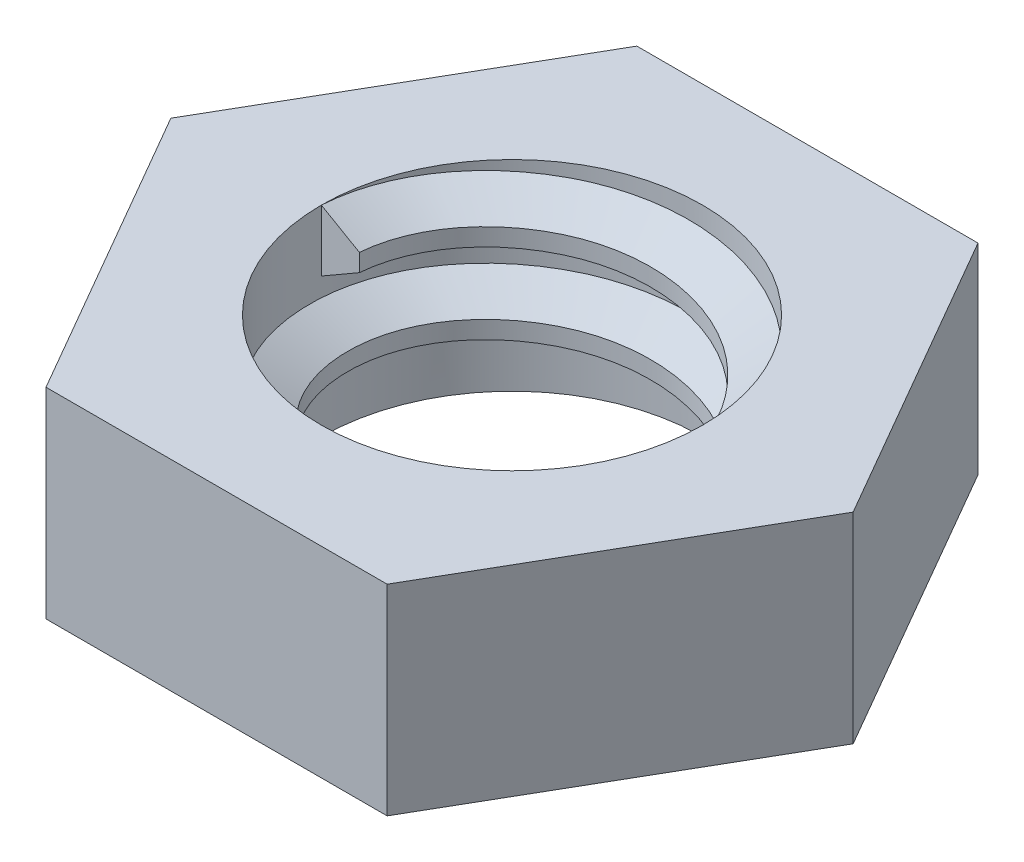
ISO-10303-21;
HEADER;
FILE_DESCRIPTION(('STEP AP214'),'2;1');
FILE_NAME('part.step','',(''),(''),'','','');
FILE_SCHEMA(('AUTOMOTIVE_DESIGN { 1 0 10303 214 1 1 1 1 }'));
ENDSEC;
DATA;
#1=APPLICATION_CONTEXT('core data for automotive mechanical design processes');
#2=APPLICATION_PROTOCOL_DEFINITION('international standard','automotive_design',2000,#1);
#3=PRODUCT_CONTEXT('',#1,'mechanical');
#4=PRODUCT('Part','Part','',(#3));
#5=PRODUCT_RELATED_PRODUCT_CATEGORY('part','',(#4));
#6=PRODUCT_DEFINITION_FORMATION('','',#4);
#7=PRODUCT_DEFINITION_CONTEXT('part definition',#1,'design');
#8=PRODUCT_DEFINITION('design','',#6,#7);
#9=PRODUCT_DEFINITION_SHAPE('','',#8);
#10=(LENGTH_UNIT() NAMED_UNIT(*) SI_UNIT(.MILLI.,.METRE.));
#11=(NAMED_UNIT(*) PLANE_ANGLE_UNIT() SI_UNIT($,.RADIAN.));
#12=(NAMED_UNIT(*) SI_UNIT($,.STERADIAN.) SOLID_ANGLE_UNIT());
#13=UNCERTAINTY_MEASURE_WITH_UNIT(LENGTH_MEASURE(1.E-05),#10,'distance_accuracy_value','');
#14=(GEOMETRIC_REPRESENTATION_CONTEXT(3) GLOBAL_UNCERTAINTY_ASSIGNED_CONTEXT((#13)) GLOBAL_UNIT_ASSIGNED_CONTEXT((#10,
#11,#12)) REPRESENTATION_CONTEXT('',''));
#15=CARTESIAN_POINT('',(0.,0.,0.));
#16=DIRECTION('',(0.,0.,1.));
#17=DIRECTION('',(1.,0.,0.));
#18=AXIS2_PLACEMENT_3D('',#15,#16,#17);
#19=CARTESIAN_POINT('',(0.,1.,0.));
#20=DIRECTION('',(0.,1.,0.));
#21=DIRECTION('',(0.,0.,1.));
#22=AXIS2_PLACEMENT_3D('',#19,#20,#21);
#23=PLANE('',#22);
#24=DIRECTION('',(0.5,0.,-0.866025403784439));
#25=VECTOR('',#24,1.);
#26=CARTESIAN_POINT('',(0.85,1.,1.47224318643355));
#27=LINE('',#26,#25);
#28=CARTESIAN_POINT('',(0.85,1.,1.47224318643355));
#29=VERTEX_POINT('',#28);
#30=CARTESIAN_POINT('',(1.7,1.,0.));
#31=VERTEX_POINT('',#30);
#32=EDGE_CURVE('E154',#29,#31,#27,.T.);
#33=ORIENTED_EDGE('',*,*,#32,.T.);
#34=DIRECTION('',(-0.5,0.,-0.866025403784439));
#35=VECTOR('',#34,1.);
#36=CARTESIAN_POINT('',(1.7,1.,0.));
#37=LINE('',#36,#35);
#38=CARTESIAN_POINT('',(0.849999999999999,1.,-1.47224318643355));
#39=VERTEX_POINT('',#38);
#40=EDGE_CURVE('E277',#31,#39,#37,.T.);
#41=ORIENTED_EDGE('',*,*,#40,.T.);
#42=DIRECTION('',(-1.,0.,0.));
#43=VECTOR('',#42,1.);
#44=CARTESIAN_POINT('',(0.849999999999999,1.,-1.47224318643355));
#45=LINE('',#44,#43);
#46=CARTESIAN_POINT('',(-0.85,1.,-1.47224318643355));
#47=VERTEX_POINT('',#46);
#48=EDGE_CURVE('E280',#39,#47,#45,.T.);
#49=ORIENTED_EDGE('',*,*,#48,.T.);
#50=DIRECTION('',(-0.5,0.,0.866025403784439));
#51=VECTOR('',#50,1.);
#52=CARTESIAN_POINT('',(-0.85,1.,-1.47224318643355));
#53=LINE('',#52,#51);
#54=CARTESIAN_POINT('',(-1.7,1.,0.));
#55=VERTEX_POINT('',#54);
#56=EDGE_CURVE('E283',#47,#55,#53,.T.);
#57=ORIENTED_EDGE('',*,*,#56,.T.);
#58=DIRECTION('',(0.5,0.,0.866025403784439));
#59=VECTOR('',#58,1.);
#60=CARTESIAN_POINT('',(-1.7,1.,0.));
#61=LINE('',#60,#59);
#62=CARTESIAN_POINT('',(-0.85,1.,1.47224318643355));
#63=VERTEX_POINT('',#62);
#64=EDGE_CURVE('E285',#55,#63,#61,.T.);
#65=ORIENTED_EDGE('',*,*,#64,.T.);
#66=DIRECTION('',(1.,0.,0.));
#67=VECTOR('',#66,1.);
#68=CARTESIAN_POINT('',(-0.85,1.,1.47224318643355));
#69=LINE('',#68,#67);
#70=EDGE_CURVE('E163',#63,#29,#69,.T.);
#71=ORIENTED_EDGE('',*,*,#70,.T.);
#72=EDGE_LOOP('',(#33,#41,#49,#57,#65,#71));
#73=FACE_BOUND('',#72,.T.);
#74=CARTESIAN_POINT('',(0.,1.,0.));
#75=DIRECTION('',(0.,1.,0.));
#76=DIRECTION('',(0.,0.,1.));
#77=AXIS2_PLACEMENT_3D('',#74,#75,#76);
#78=CIRCLE('',#77,0.95);
#79=CARTESIAN_POINT('',(-0.95,1.,0.));
#80=VERTEX_POINT('',#79);
#81=EDGE_CURVE('E88',#80,#80,#78,.T.);
#82=ORIENTED_EDGE('',*,*,#81,.F.);
#83=EDGE_LOOP('',(#82));
#84=FACE_BOUND('',#83,.T.);
#85=ADVANCED_FACE('F51',(#73,#84),#23,.T.);
#86=CARTESIAN_POINT('',(0.,0.,0.));
#87=DIRECTION('',(0.,1.,0.));
#88=DIRECTION('',(0.,0.,1.));
#89=AXIS2_PLACEMENT_3D('',#86,#87,#88);
#90=PLANE('',#89);
#91=DIRECTION('',(0.5,0.,-0.866025403784439));
#92=VECTOR('',#91,1.);
#93=CARTESIAN_POINT('',(0.85,0.,1.47224318643355));
#94=LINE('',#93,#92);
#95=CARTESIAN_POINT('',(0.85,0.,1.47224318643355));
#96=VERTEX_POINT('',#95);
#97=CARTESIAN_POINT('',(1.7,0.,0.));
#98=VERTEX_POINT('',#97);
#99=EDGE_CURVE('E160',#96,#98,#94,.T.);
#100=ORIENTED_EDGE('',*,*,#99,.F.);
#101=DIRECTION('',(1.,0.,0.));
#102=VECTOR('',#101,1.);
#103=CARTESIAN_POINT('',(-0.85,0.,1.47224318643355));
#104=LINE('',#103,#102);
#105=CARTESIAN_POINT('',(-0.85,0.,1.47224318643355));
#106=VERTEX_POINT('',#105);
#107=EDGE_CURVE('E142',#106,#96,#104,.T.);
#108=ORIENTED_EDGE('',*,*,#107,.F.);
#109=DIRECTION('',(0.5,0.,0.866025403784439));
#110=VECTOR('',#109,1.);
#111=CARTESIAN_POINT('',(-1.7,0.,0.));
#112=LINE('',#111,#110);
#113=CARTESIAN_POINT('',(-1.7,0.,0.));
#114=VERTEX_POINT('',#113);
#115=EDGE_CURVE('E155',#114,#106,#112,.T.);
#116=ORIENTED_EDGE('',*,*,#115,.F.);
#117=DIRECTION('',(-0.5,0.,0.866025403784439));
#118=VECTOR('',#117,1.);
#119=CARTESIAN_POINT('',(-0.85,0.,-1.47224318643355));
#120=LINE('',#119,#118);
#121=CARTESIAN_POINT('',(-0.85,0.,-1.47224318643355));
#122=VERTEX_POINT('',#121);
#123=EDGE_CURVE('E182',#122,#114,#120,.T.);
#124=ORIENTED_EDGE('',*,*,#123,.F.);
#125=DIRECTION('',(-1.,0.,0.));
#126=VECTOR('',#125,1.);
#127=CARTESIAN_POINT('',(0.849999999999999,0.,-1.47224318643355));
#128=LINE('',#127,#126);
#129=CARTESIAN_POINT('',(0.849999999999999,0.,-1.47224318643355));
#130=VERTEX_POINT('',#129);
#131=EDGE_CURVE('E173',#130,#122,#128,.T.);
#132=ORIENTED_EDGE('',*,*,#131,.F.);
#133=DIRECTION('',(-0.5,0.,-0.866025403784439));
#134=VECTOR('',#133,1.);
#135=CARTESIAN_POINT('',(1.7,0.,0.));
#136=LINE('',#135,#134);
#137=EDGE_CURVE('E168',#98,#130,#136,.T.);
#138=ORIENTED_EDGE('',*,*,#137,.F.);
#139=EDGE_LOOP('',(#100,#108,#116,#124,#132,#138));
#140=FACE_BOUND('',#139,.T.);
#141=CARTESIAN_POINT('',(0.,0.,0.));
#142=DIRECTION('',(0.,1.,0.));
#143=DIRECTION('',(0.,0.,1.));
#144=AXIS2_PLACEMENT_3D('',#141,#142,#143);
#145=CIRCLE('',#144,0.95);
#146=CARTESIAN_POINT('',(0.148604981954542,0.00198897041404559,0.938305152491235));
#147=VERTEX_POINT('',#146);
#148=EDGE_CURVE('E175',#147,#147,#145,.T.);
#149=ORIENTED_EDGE('',*,*,#148,.T.);
#150=EDGE_LOOP('',(#149));
#151=FACE_BOUND('',#150,.T.);
#152=ADVANCED_FACE('F165',(#140,#151),#90,.F.);
#153=CARTESIAN_POINT('',(0.85,1.,1.47224318643355));
#154=DIRECTION('',(-0.866025403784439,0.,-0.5));
#155=DIRECTION('',(-0.5,0.,0.866025403784439));
#156=AXIS2_PLACEMENT_3D('',#153,#154,#155);
#157=PLANE('',#156);
#158=ORIENTED_EDGE('',*,*,#99,.T.);
#159=DIRECTION('',(0.,-1.,0.));
#160=VECTOR('',#159,1.);
#161=CARTESIAN_POINT('',(1.7,1.,0.));
#162=LINE('',#161,#160);
#163=EDGE_CURVE('E12',#31,#98,#162,.T.);
#164=ORIENTED_EDGE('',*,*,#163,.F.);
#165=ORIENTED_EDGE('',*,*,#32,.F.);
#166=DIRECTION('',(0.,-1.,0.));
#167=VECTOR('',#166,1.);
#168=CARTESIAN_POINT('',(0.85,1.,1.47224318643355));
#169=LINE('',#168,#167);
#170=EDGE_CURVE('E146',#29,#96,#169,.T.);
#171=ORIENTED_EDGE('',*,*,#170,.T.);
#172=EDGE_LOOP('',(#158,#164,#165,#171));
#173=FACE_BOUND('',#172,.T.);
#174=ADVANCED_FACE('F53',(#173),#157,.F.);
#175=CARTESIAN_POINT('',(1.7,1.,0.));
#176=DIRECTION('',(-0.866025403784439,0.,0.5));
#177=DIRECTION('',(0.5,0.,0.866025403784439));
#178=AXIS2_PLACEMENT_3D('',#175,#176,#177);
#179=PLANE('',#178);
#180=ORIENTED_EDGE('',*,*,#137,.T.);
#181=DIRECTION('',(0.,-1.,0.));
#182=VECTOR('',#181,1.);
#183=CARTESIAN_POINT('',(0.849999999999999,1.,-1.47224318643355));
#184=LINE('',#183,#182);
#185=EDGE_CURVE('E63',#39,#130,#184,.T.);
#186=ORIENTED_EDGE('',*,*,#185,.F.);
#187=ORIENTED_EDGE('',*,*,#40,.F.);
#188=ORIENTED_EDGE('',*,*,#163,.T.);
#189=EDGE_LOOP('',(#180,#186,#187,#188));
#190=FACE_BOUND('',#189,.T.);
#191=ADVANCED_FACE('F292',(#190),#179,.F.);
#192=CARTESIAN_POINT('',(0.849999999999999,1.,-1.47224318643355));
#193=DIRECTION('',(0.,0.,1.));
#194=DIRECTION('',(1.,0.,0.));
#195=AXIS2_PLACEMENT_3D('',#192,#193,#194);
#196=PLANE('',#195);
#197=ORIENTED_EDGE('',*,*,#131,.T.);
#198=DIRECTION('',(0.,-1.,0.));
#199=VECTOR('',#198,1.);
#200=CARTESIAN_POINT('',(-0.85,1.,-1.47224318643355));
#201=LINE('',#200,#199);
#202=EDGE_CURVE('E193',#47,#122,#201,.T.);
#203=ORIENTED_EDGE('',*,*,#202,.F.);
#204=ORIENTED_EDGE('',*,*,#48,.F.);
#205=ORIENTED_EDGE('',*,*,#185,.T.);
#206=EDGE_LOOP('',(#197,#203,#204,#205));
#207=FACE_BOUND('',#206,.T.);
#208=ADVANCED_FACE('F296',(#207),#196,.F.);
#209=CARTESIAN_POINT('',(-0.85,1.,-1.47224318643355));
#210=DIRECTION('',(0.866025403784439,0.,0.5));
#211=DIRECTION('',(0.5,0.,-0.866025403784439));
#212=AXIS2_PLACEMENT_3D('',#209,#210,#211);
#213=PLANE('',#212);
#214=ORIENTED_EDGE('',*,*,#123,.T.);
#215=DIRECTION('',(0.,-1.,0.));
#216=VECTOR('',#215,1.);
#217=CARTESIAN_POINT('',(-1.7,1.,0.));
#218=LINE('',#217,#216);
#219=EDGE_CURVE('E189',#55,#114,#218,.T.);
#220=ORIENTED_EDGE('',*,*,#219,.F.);
#221=ORIENTED_EDGE('',*,*,#56,.F.);
#222=ORIENTED_EDGE('',*,*,#202,.T.);
#223=EDGE_LOOP('',(#214,#220,#221,#222));
#224=FACE_BOUND('',#223,.T.);
#225=ADVANCED_FACE('F300',(#224),#213,.F.);
#226=CARTESIAN_POINT('',(-1.7,1.,0.));
#227=DIRECTION('',(0.866025403784439,0.,-0.5));
#228=DIRECTION('',(-0.5,0.,-0.866025403784439));
#229=AXIS2_PLACEMENT_3D('',#226,#227,#228);
#230=PLANE('',#229);
#231=ORIENTED_EDGE('',*,*,#115,.T.);
#232=DIRECTION('',(0.,-1.,0.));
#233=VECTOR('',#232,1.);
#234=CARTESIAN_POINT('',(-0.85,1.,1.47224318643355));
#235=LINE('',#234,#233);
#236=EDGE_CURVE('E149',#63,#106,#235,.T.);
#237=ORIENTED_EDGE('',*,*,#236,.F.);
#238=ORIENTED_EDGE('',*,*,#64,.F.);
#239=ORIENTED_EDGE('',*,*,#219,.T.);
#240=EDGE_LOOP('',(#231,#237,#238,#239));
#241=FACE_BOUND('',#240,.T.);
#242=ADVANCED_FACE('F303',(#241),#230,.F.);
#243=CARTESIAN_POINT('',(-0.85,1.,1.47224318643355));
#244=DIRECTION('',(0.,0.,-1.));
#245=DIRECTION('',(-1.,0.,0.));
#246=AXIS2_PLACEMENT_3D('',#243,#244,#245);
#247=PLANE('',#246);
#248=ORIENTED_EDGE('',*,*,#107,.T.);
#249=ORIENTED_EDGE('',*,*,#170,.F.);
#250=ORIENTED_EDGE('',*,*,#70,.F.);
#251=ORIENTED_EDGE('',*,*,#236,.T.);
#252=EDGE_LOOP('',(#248,#249,#250,#251));
#253=FACE_BOUND('',#252,.T.);
#254=ADVANCED_FACE('F144',(#253),#247,.F.);
#255=CARTESIAN_POINT('',(0.,1.,0.));
#256=DIRECTION('',(0.,-1.,0.));
#257=DIRECTION('',(0.,0.,-1.));
#258=AXIS2_PLACEMENT_3D('',#255,#256,#257);
#259=CYLINDRICAL_SURFACE('',#258,0.95);
#260=DIRECTION('',(0.,1.,0.));
#261=VECTOR('',#260,1.);
#262=CARTESIAN_POINT('',(-0.95,0.945312500238979,0.));
#263=LINE('',#262,#261);
#264=CARTESIAN_POINT('',(-0.95,0.693750000955916,0.));
#265=VERTEX_POINT('',#264);
#266=EDGE_CURVE('E206',#80,#265,#263,.F.);
#267=ORIENTED_EDGE('',*,*,#266,.F.);
#268=ORIENTED_EDGE('',*,*,#81,.T.);
#269=CARTESIAN_POINT('',(-0.95,1.,0.));
#270=CARTESIAN_POINT('',(-0.95,0.966666666666667,-0.548482755730144));
#271=CARTESIAN_POINT('',(-0.475,0.933333333333333,-0.822724133595217));
#272=CARTESIAN_POINT('',(0.,0.9,-1.09696551146029));
#273=CARTESIAN_POINT('',(0.475,0.866666666666667,-0.822724133595217));
#274=CARTESIAN_POINT('',(0.95,0.833333333333333,-0.548482755730145));
#275=CARTESIAN_POINT('',(0.95,0.8,0.));
#276=CARTESIAN_POINT('',(0.95,0.766666666666667,0.548482755730144));
#277=CARTESIAN_POINT('',(0.475,0.733333333333333,0.822724133595216));
#278=CARTESIAN_POINT('',(0.,0.7,1.09696551146029));
#279=CARTESIAN_POINT('',(-0.474999999999999,0.666666666666667,0.822724133595217));
#280=CARTESIAN_POINT('',(-0.95,0.633333333333333,0.548482755730145));
#281=CARTESIAN_POINT('',(-0.95,0.6,0.));
#282=CARTESIAN_POINT('',(-0.95,0.566666666666667,-0.548482755730144));
#283=CARTESIAN_POINT('',(-0.475,0.533333333333333,-0.822724133595217));
#284=CARTESIAN_POINT('',(0.,0.5,-1.09696551146029));
#285=CARTESIAN_POINT('',(0.475,0.466666666666667,-0.822724133595217));
#286=CARTESIAN_POINT('',(0.95,0.433333333333333,-0.548482755730145));
#287=CARTESIAN_POINT('',(0.95,0.4,0.));
#288=CARTESIAN_POINT('',(0.95,0.366666666666667,0.548482755730144));
#289=CARTESIAN_POINT('',(0.475,0.333333333333333,0.822724133595216));
#290=CARTESIAN_POINT('',(0.322496472395081,0.322631331396146,0.910772086310284));
#291=CARTESIAN_POINT('',(0.148567264836274,0.310425772970967,0.938311125277255));
#292=(BOUNDED_CURVE() B_SPLINE_CURVE(2,(#269,#270,#271,#272,#273,#274,#275,#276,#277,#278,#279,
#280,#281,#282,#283,#284,#285,#286,#287,#288,#289,#290,#291),.UNSPECIFIED.,.F.,
.F.) B_SPLINE_CURVE_WITH_KNOTS((3,2,2,2,2,2,2,2,2,2,2,3),(0.,0.0833333333333333,
0.166666666666667,0.25,0.333333333333333,0.416666666666667,0.5,0.583333333333333,
0.666666666666667,0.75,0.833333333333333,0.862765509673159),
.UNSPECIFIED.) CURVE() GEOMETRIC_REPRESENTATION_ITEM() RATIONAL_B_SPLINE_CURVE((1.,
0.866025403784439,1.,0.866025403784439,1.,0.866025403784439,1.,0.866025403784439,1.,
0.866025403784439,1.,0.866025403784439,1.,0.866025403784439,1.,0.866025403784439,1.,
0.866025403784439,1.,0.866025403784439,1.,0.95268203270952,0.938788163595093)) REPRESENTATION_ITEM(''));
#293=CARTESIAN_POINT('',(0.148567264836274,0.310425772970967,0.938311125277255));
#294=VERTEX_POINT('',#293);
#295=EDGE_CURVE('E79',#80,#294,#292,.T.);
#296=ORIENTED_EDGE('',*,*,#295,.T.);
#297=DIRECTION('',(-0.000197994769630762,0.999999979906905,3.13729444486257E-05));
#298=VECTOR('',#297,1.);
#299=CARTESIAN_POINT('',(0.148572679415215,0.283082023090456,0.938310271584599));
#300=LINE('',#299,#298);
#301=EDGE_CURVE('E209',#147,#294,#300,.T.);
#302=ORIENTED_EDGE('',*,*,#301,.F.);
#303=ORIENTED_EDGE('',*,*,#148,.F.);
#304=CARTESIAN_POINT('',(-0.95,0.693750000955916,0.));
#305=CARTESIAN_POINT('',(-0.95,0.660416667622582,-0.548482755730144));
#306=CARTESIAN_POINT('',(-0.475,0.627083334289249,-0.822724133595217));
#307=CARTESIAN_POINT('',(0.,0.593750000955915,-1.09696551146029));
#308=CARTESIAN_POINT('',(0.475,0.560416667622582,-0.822724133595217));
#309=CARTESIAN_POINT('',(0.95,0.527083334289249,-0.548482755730145));
#310=CARTESIAN_POINT('',(0.95,0.493750000955916,0.));
#311=CARTESIAN_POINT('',(0.95,0.460416667622582,0.548482755730144));
#312=CARTESIAN_POINT('',(0.475,0.427083334289249,0.822724133595216));
#313=CARTESIAN_POINT('',(0.,0.393750000955915,1.09696551146029));
#314=CARTESIAN_POINT('',(-0.474999999999999,0.360416667622582,0.822724133595217));
#315=CARTESIAN_POINT('',(-0.95,0.327083334289249,0.548482755730145));
#316=CARTESIAN_POINT('',(-0.95,0.293750000955915,0.));
#317=CARTESIAN_POINT('',(-0.95,0.260416667622582,-0.548482755730144));
#318=CARTESIAN_POINT('',(-0.475,0.227083334289249,-0.822724133595217));
#319=CARTESIAN_POINT('',(0.,0.193750000955915,-1.09696551146029));
#320=CARTESIAN_POINT('',(0.475,0.160416667622582,-0.822724133595217));
#321=CARTESIAN_POINT('',(0.95,0.127083334289249,-0.548482755730145));
#322=CARTESIAN_POINT('',(0.95,0.0937500009559154,0.));
#323=CARTESIAN_POINT('',(0.95,0.0604166676225821,0.548482755730144));
#324=CARTESIAN_POINT('',(0.475,0.0270833342892487,0.822724133595216));
#325=CARTESIAN_POINT('',(0.322503841786664,0.016381849502348,0.91076783159007));
#326=CARTESIAN_POINT('',(0.148583515934073,0.00417691435479775,0.93830855201936));
#327=(BOUNDED_CURVE() B_SPLINE_CURVE(2,(#304,#305,#306,#307,#308,#309,#310,#311,#312,#313,#314,
#315,#316,#317,#318,#319,#320,#321,#322,#323,#324,#325,#326),.UNSPECIFIED.,.F.,
.F.) B_SPLINE_CURVE_WITH_KNOTS((3,2,2,2,2,2,2,2,2,2,2,3),(0.,0.0833333333333333,
0.166666666666667,0.25,0.333333333333333,0.416666666666667,0.5,0.583333333333333,
0.666666666666667,0.75,0.833333333333333,0.862764154723721),
.UNSPECIFIED.) CURVE() GEOMETRIC_REPRESENTATION_ITEM() RATIONAL_B_SPLINE_CURVE((1.,
0.866025403784439,1.,0.866025403784439,1.,0.866025403784439,1.,0.866025403784439,1.,
0.866025403784439,1.,0.866025403784439,1.,0.866025403784439,1.,0.866025403784439,1.,
0.866025403784439,1.,0.866025403784439,1.,0.952684211055165,0.938789442911468)) REPRESENTATION_ITEM(''));
#328=EDGE_CURVE('E71',#265,#147,#327,.T.);
#329=ORIENTED_EDGE('',*,*,#328,.F.);
#330=EDGE_LOOP('',(#267,#268,#296,#302,#303,#329));
#331=FACE_BOUND('',#330,.T.);
#332=ADVANCED_FACE('F263',(#331),#259,.F.);
#333=CARTESIAN_POINT('',(-0.855278471875,0.945312500238979,0.));
#334=DIRECTION('',(0.,0.,1.));
#335=DIRECTION('',(1.,0.,0.));
#336=AXIS2_PLACEMENT_3D('',#333,#334,#335);
#337=PLANE('',#336);
#338=CARTESIAN_POINT('',(-0.76055694375,0.890625000477958,0.));
#339=CARTESIAN_POINT('',(-0.95,1.,0.));
#340=(BOUNDED_CURVE() B_SPLINE_CURVE(1,(#338,#339),.UNSPECIFIED.,.F.,
.F.) B_SPLINE_CURVE_WITH_KNOTS((2,2),(0.,1.),
.UNSPECIFIED.) CURVE() GEOMETRIC_REPRESENTATION_ITEM() RATIONAL_B_SPLINE_CURVE((1.,1.)) REPRESENTATION_ITEM(''));
#341=CARTESIAN_POINT('',(-0.76055694375,0.890625000477958,0.));
#342=VERTEX_POINT('',#341);
#343=EDGE_CURVE('E527',#342,#80,#340,.T.);
#344=ORIENTED_EDGE('',*,*,#343,.T.);
#345=ORIENTED_EDGE('',*,*,#266,.T.);
#346=CARTESIAN_POINT('',(-0.95,0.693750000955916,0.));
#347=CARTESIAN_POINT('',(-0.76055694375,0.803125000477958,0.));
#348=(BOUNDED_CURVE() B_SPLINE_CURVE(1,(#346,#347),.UNSPECIFIED.,.F.,
.F.) B_SPLINE_CURVE_WITH_KNOTS((2,2),(0.,1.),
.UNSPECIFIED.) CURVE() GEOMETRIC_REPRESENTATION_ITEM() RATIONAL_B_SPLINE_CURVE((1.,1.)) REPRESENTATION_ITEM(''));
#349=CARTESIAN_POINT('',(-0.76055694375,0.803125000477958,0.));
#350=VERTEX_POINT('',#349);
#351=EDGE_CURVE('E95',#265,#350,#348,.T.);
#352=ORIENTED_EDGE('',*,*,#351,.T.);
#353=CARTESIAN_POINT('',(-0.76055694375,0.803125000477958,0.));
#354=CARTESIAN_POINT('',(-0.76055694375,0.890625000477958,0.));
#355=(BOUNDED_CURVE() B_SPLINE_CURVE(1,(#353,#354),.UNSPECIFIED.,.F.,
.F.) B_SPLINE_CURVE_WITH_KNOTS((2,2),(0.,1.),
.UNSPECIFIED.) CURVE() GEOMETRIC_REPRESENTATION_ITEM() RATIONAL_B_SPLINE_CURVE((1.,1.)) REPRESENTATION_ITEM(''));
#356=EDGE_CURVE('E240',#350,#342,#355,.T.);
#357=ORIENTED_EDGE('',*,*,#356,.T.);
#358=EDGE_LOOP('',(#344,#345,#352,#357));
#359=FACE_BOUND('',#358,.T.);
#360=ADVANCED_FACE('F261',(#359),#337,.T.);
#361=CARTESIAN_POINT('',(0.141160676228567,0.283082023090456,0.891533091780965));
#362=DIRECTION('',(0.987677794935856,0.000200464935698279,-0.156500904803949));
#363=DIRECTION('',(-0.156500907948536,0.,-0.987677814781361));
#364=AXIS2_PLACEMENT_3D('',#361,#362,#363);
#365=PLANE('',#364);
#366=CARTESIAN_POINT('',(0.118940910405446,0.201050773448924,0.751198991292097));
#367=CARTESIAN_POINT('',(0.148567264836274,0.310425772970967,0.938311125277255));
#368=(BOUNDED_CURVE() B_SPLINE_CURVE(1,(#366,#367),.UNSPECIFIED.,.F.,
.F.) B_SPLINE_CURVE_WITH_KNOTS((2,2),(0.,1.),
.UNSPECIFIED.) CURVE() GEOMETRIC_REPRESENTATION_ITEM() RATIONAL_B_SPLINE_CURVE((0.938788163595093,0.938788163595093)) REPRESENTATION_ITEM(''));
#369=CARTESIAN_POINT('',(0.118940910405446,0.201050773448924,0.751198991292097));
#370=VERTEX_POINT('',#369);
#371=EDGE_CURVE('E203',#294,#370,#368,.F.);
#372=ORIENTED_EDGE('',*,*,#371,.T.);
#373=CARTESIAN_POINT('',(0.118940910405446,0.113550773448924,0.751198991292097));
#374=CARTESIAN_POINT('',(0.118940910405446,0.201050773448924,0.751198991292097));
#375=(BOUNDED_CURVE() B_SPLINE_CURVE(1,(#373,#374),.UNSPECIFIED.,.F.,
.F.) B_SPLINE_CURVE_WITH_KNOTS((2,2),(0.,1.),
.UNSPECIFIED.) CURVE() GEOMETRIC_REPRESENTATION_ITEM() RATIONAL_B_SPLINE_CURVE((0.938788163595093,0.938788163595093)) REPRESENTATION_ITEM(''));
#376=CARTESIAN_POINT('',(0.118947415608222,0.113551343662882,0.751197961234645));
#377=VERTEX_POINT('',#376);
#378=EDGE_CURVE('E237',#370,#377,#375,.F.);
#379=ORIENTED_EDGE('',*,*,#378,.T.);
#380=CARTESIAN_POINT('',(0.148583515934073,0.00417691435479775,0.93830855201936));
#381=CARTESIAN_POINT('',(0.118953920810998,0.11355191387684,0.751196931177192));
#382=(BOUNDED_CURVE() B_SPLINE_CURVE(1,(#380,#381),.UNSPECIFIED.,.F.,
.F.) B_SPLINE_CURVE_WITH_KNOTS((2,2),(0.,1.),
.UNSPECIFIED.) CURVE() GEOMETRIC_REPRESENTATION_ITEM() RATIONAL_B_SPLINE_CURVE((0.938789442911468,0.938789442911468)) REPRESENTATION_ITEM(''));
#383=EDGE_CURVE('E228',#377,#147,#382,.F.);
#384=ORIENTED_EDGE('',*,*,#383,.T.);
#385=ORIENTED_EDGE('',*,*,#301,.T.);
#386=EDGE_LOOP('',(#372,#379,#384,#385));
#387=FACE_BOUND('',#386,.T.);
#388=ADVANCED_FACE('F234',(#387),#365,.F.);
#389=CARTESIAN_POINT('',(-0.76055694375,0.890625000477958,0.));
#390=CARTESIAN_POINT('',(-0.76055694375,0.857291667144624,-0.439107756208101));
#391=CARTESIAN_POINT('',(-0.380278471875,0.823958333811291,-0.658661634312152));
#392=CARTESIAN_POINT('',(0.,0.790625000477958,-0.878215512416203));
#393=CARTESIAN_POINT('',(0.380278471875,0.757291667144624,-0.658661634312152));
#394=CARTESIAN_POINT('',(0.76055694375,0.723958333811291,-0.439107756208102));
#395=CARTESIAN_POINT('',(0.76055694375,0.690625000477958,0.));
#396=CARTESIAN_POINT('',(0.76055694375,0.657291667144624,0.439107756208101));
#397=CARTESIAN_POINT('',(0.380278471875,0.623958333811291,0.658661634312152));
#398=CARTESIAN_POINT('',(0.,0.590625000477958,0.878215512416203));
#399=CARTESIAN_POINT('',(-0.380278471874999,0.557291667144624,0.658661634312153));
#400=CARTESIAN_POINT('',(-0.76055694375,0.523958333811291,0.439107756208102));
#401=CARTESIAN_POINT('',(-0.76055694375,0.490625000477958,0.));
#402=CARTESIAN_POINT('',(-0.76055694375,0.457291667144624,-0.439107756208101));
#403=CARTESIAN_POINT('',(-0.380278471875,0.423958333811291,-0.658661634312152));
#404=CARTESIAN_POINT('',(0.,0.390625000477958,-0.878215512416203));
#405=CARTESIAN_POINT('',(0.380278471875,0.357291667144624,-0.658661634312152));
#406=CARTESIAN_POINT('',(0.76055694375,0.323958333811291,-0.439107756208102));
#407=CARTESIAN_POINT('',(0.76055694375,0.290625000477958,0.));
#408=CARTESIAN_POINT('',(0.76055694375,0.257291667144624,0.439107756208101));
#409=CARTESIAN_POINT('',(0.380278471875,0.223958333811291,0.658661634312152));
#410=CARTESIAN_POINT('',(0.258186243594694,0.213256331874104,0.729151615175748));
#411=CARTESIAN_POINT('',(0.118940910405446,0.201050773448924,0.751198991292097));
#412=CARTESIAN_POINT('',(-0.95,1.,0.));
#413=CARTESIAN_POINT('',(-0.95,0.966666666666667,-0.548482755730144));
#414=CARTESIAN_POINT('',(-0.475,0.933333333333333,-0.822724133595217));
#415=CARTESIAN_POINT('',(0.,0.9,-1.09696551146029));
#416=CARTESIAN_POINT('',(0.475,0.866666666666667,-0.822724133595217));
#417=CARTESIAN_POINT('',(0.95,0.833333333333333,-0.548482755730145));
#418=CARTESIAN_POINT('',(0.95,0.8,0.));
#419=CARTESIAN_POINT('',(0.95,0.766666666666667,0.548482755730144));
#420=CARTESIAN_POINT('',(0.475,0.733333333333333,0.822724133595216));
#421=CARTESIAN_POINT('',(0.,0.7,1.09696551146029));
#422=CARTESIAN_POINT('',(-0.474999999999999,0.666666666666667,0.822724133595217));
#423=CARTESIAN_POINT('',(-0.95,0.633333333333333,0.548482755730145));
#424=CARTESIAN_POINT('',(-0.95,0.6,0.));
#425=CARTESIAN_POINT('',(-0.95,0.566666666666667,-0.548482755730144));
#426=CARTESIAN_POINT('',(-0.475,0.533333333333333,-0.822724133595217));
#427=CARTESIAN_POINT('',(0.,0.5,-1.09696551146029));
#428=CARTESIAN_POINT('',(0.475,0.466666666666667,-0.822724133595217));
#429=CARTESIAN_POINT('',(0.95,0.433333333333333,-0.548482755730145));
#430=CARTESIAN_POINT('',(0.95,0.4,0.));
#431=CARTESIAN_POINT('',(0.95,0.366666666666667,0.548482755730144));
#432=CARTESIAN_POINT('',(0.475,0.333333333333333,0.822724133595216));
#433=CARTESIAN_POINT('',(0.322496472395081,0.322631331396146,0.910772086310284));
#434=CARTESIAN_POINT('',(0.148567264836274,0.310425772970967,0.938311125277255));
#435=(BOUNDED_SURFACE() B_SPLINE_SURFACE(1,2,((#389,#390,#391,#392,#393,#394,#395,#396,#397,
#398,#399,#400,#401,#402,#403,#404,#405,#406,#407,#408,#409,#410,#411),(#412,#413,#414,#415,
#416,#417,#418,#419,#420,#421,#422,#423,#424,#425,#426,#427,#428,#429,#430,#431,#432,#433,
#434)),.UNSPECIFIED.,.F.,.F.,.F.) B_SPLINE_SURFACE_WITH_KNOTS((2,2),(3,2,2,2,2,2,2,2,2,2,2,3),
(0.,1.),(0.,0.0833333333333333,0.166666666666667,0.25,0.333333333333333,0.416666666666667,0.5,
0.583333333333333,0.666666666666667,0.75,0.833333333333333,0.862765509673159),
.UNSPECIFIED.) GEOMETRIC_REPRESENTATION_ITEM() RATIONAL_B_SPLINE_SURFACE(((1.,0.866025403784439,
1.,0.866025403784439,1.,0.866025403784439,1.,0.866025403784439,1.,0.866025403784439,1.,
0.866025403784439,1.,0.866025403784439,1.,0.866025403784439,1.,0.866025403784439,1.,
0.866025403784439,1.,0.95268203270952,0.938788163595093),(1.,0.866025403784439,1.,
0.866025403784439,1.,0.866025403784439,1.,0.866025403784439,1.,0.866025403784439,1.,
0.866025403784439,1.,0.866025403784439,1.,0.866025403784439,1.,0.866025403784439,1.,
0.866025403784439,1.,0.95268203270952,0.938788163595093))) REPRESENTATION_ITEM('') SURFACE());
#436=CARTESIAN_POINT('',(-0.76055694375,0.890625000477958,0.));
#437=CARTESIAN_POINT('',(-0.76055694375,0.857291667144624,-0.439107756208101));
#438=CARTESIAN_POINT('',(-0.380278471875,0.823958333811291,-0.658661634312152));
#439=CARTESIAN_POINT('',(0.,0.790625000477958,-0.878215512416203));
#440=CARTESIAN_POINT('',(0.380278471875,0.757291667144624,-0.658661634312152));
#441=CARTESIAN_POINT('',(0.76055694375,0.723958333811291,-0.439107756208102));
#442=CARTESIAN_POINT('',(0.76055694375,0.690625000477958,0.));
#443=CARTESIAN_POINT('',(0.76055694375,0.657291667144624,0.439107756208101));
#444=CARTESIAN_POINT('',(0.380278471875,0.623958333811291,0.658661634312152));
#445=CARTESIAN_POINT('',(0.,0.590625000477958,0.878215512416203));
#446=CARTESIAN_POINT('',(-0.380278471874999,0.557291667144624,0.658661634312153));
#447=CARTESIAN_POINT('',(-0.76055694375,0.523958333811291,0.439107756208102));
#448=CARTESIAN_POINT('',(-0.76055694375,0.490625000477958,0.));
#449=CARTESIAN_POINT('',(-0.76055694375,0.457291667144624,-0.439107756208101));
#450=CARTESIAN_POINT('',(-0.380278471875,0.423958333811291,-0.658661634312152));
#451=CARTESIAN_POINT('',(0.,0.390625000477958,-0.878215512416203));
#452=CARTESIAN_POINT('',(0.380278471875,0.357291667144624,-0.658661634312152));
#453=CARTESIAN_POINT('',(0.76055694375,0.323958333811291,-0.439107756208102));
#454=CARTESIAN_POINT('',(0.76055694375,0.290625000477958,0.));
#455=CARTESIAN_POINT('',(0.76055694375,0.257291667144624,0.439107756208101));
#456=CARTESIAN_POINT('',(0.380278471875,0.223958333811291,0.658661634312152));
#457=CARTESIAN_POINT('',(0.258186243594694,0.213256331874104,0.729151615175748));
#458=CARTESIAN_POINT('',(0.118940910405446,0.201050773448924,0.751198991292097));
#459=(BOUNDED_CURVE() B_SPLINE_CURVE(2,(#436,#437,#438,#439,#440,#441,#442,#443,#444,#445,#446,
#447,#448,#449,#450,#451,#452,#453,#454,#455,#456,#457,#458),.UNSPECIFIED.,.F.,
.F.) B_SPLINE_CURVE_WITH_KNOTS((3,2,2,2,2,2,2,2,2,2,2,3),(0.,0.0833333333333333,
0.166666666666667,0.25,0.333333333333333,0.416666666666667,0.5,0.583333333333333,
0.666666666666667,0.75,0.833333333333333,0.862765509673159),
.UNSPECIFIED.) CURVE() GEOMETRIC_REPRESENTATION_ITEM() RATIONAL_B_SPLINE_CURVE((1.,
0.866025403784439,1.,0.866025403784439,1.,0.866025403784439,1.,0.866025403784439,1.,
0.866025403784439,1.,0.866025403784439,1.,0.866025403784439,1.,0.866025403784439,1.,
0.866025403784439,1.,0.866025403784439,1.,0.95268203270952,0.938788163595093)) REPRESENTATION_ITEM(''));
#460=EDGE_CURVE('E513',#342,#370,#459,.T.);
#461=ORIENTED_EDGE('',*,*,#343,.F.);
#462=ORIENTED_EDGE('',*,*,#460,.T.);
#463=ORIENTED_EDGE('',*,*,#371,.F.);
#464=ORIENTED_EDGE('',*,*,#295,.F.);
#465=EDGE_LOOP('',(#461,#462,#463,#464));
#466=FACE_BOUND('',#465,.T.);
#467=ADVANCED_FACE('F260',(#466),#435,.F.);
#468=CARTESIAN_POINT('',(-0.76055694375,0.803125000477958,0.));
#469=CARTESIAN_POINT('',(-0.76055694375,0.769791667144624,-0.439107756208101));
#470=CARTESIAN_POINT('',(-0.380278471875,0.736458333811291,-0.658661634312152));
#471=CARTESIAN_POINT('',(0.,0.703125000477958,-0.878215512416203));
#472=CARTESIAN_POINT('',(0.380278471875,0.669791667144624,-0.658661634312152));
#473=CARTESIAN_POINT('',(0.76055694375,0.636458333811291,-0.439107756208102));
#474=CARTESIAN_POINT('',(0.76055694375,0.603125000477958,0.));
#475=CARTESIAN_POINT('',(0.76055694375,0.569791667144624,0.439107756208101));
#476=CARTESIAN_POINT('',(0.380278471875,0.536458333811291,0.658661634312152));
#477=CARTESIAN_POINT('',(0.,0.503125000477958,0.878215512416203));
#478=CARTESIAN_POINT('',(-0.380278471874999,0.469791667144624,0.658661634312153));
#479=CARTESIAN_POINT('',(-0.76055694375,0.436458333811291,0.439107756208102));
#480=CARTESIAN_POINT('',(-0.76055694375,0.403125000477958,0.));
#481=CARTESIAN_POINT('',(-0.76055694375,0.369791667144624,-0.439107756208101));
#482=CARTESIAN_POINT('',(-0.380278471875,0.336458333811291,-0.658661634312152));
#483=CARTESIAN_POINT('',(0.,0.303125000477958,-0.878215512416203));
#484=CARTESIAN_POINT('',(0.380278471875,0.269791667144624,-0.658661634312152));
#485=CARTESIAN_POINT('',(0.76055694375,0.236458333811291,-0.439107756208102));
#486=CARTESIAN_POINT('',(0.76055694375,0.203125000477958,0.));
#487=CARTESIAN_POINT('',(0.76055694375,0.169791667144624,0.439107756208101));
#488=CARTESIAN_POINT('',(0.380278471875,0.136458333811291,0.658661634312152));
#489=CARTESIAN_POINT('',(0.258186243594694,0.125756331874104,0.729151615175748));
#490=CARTESIAN_POINT('',(0.118940910405446,0.113550773448924,0.751198991292097));
#491=CARTESIAN_POINT('',(-0.76055694375,0.890625000477958,0.));
#492=CARTESIAN_POINT('',(-0.76055694375,0.857291667144624,-0.439107756208101));
#493=CARTESIAN_POINT('',(-0.380278471875,0.823958333811291,-0.658661634312152));
#494=CARTESIAN_POINT('',(0.,0.790625000477958,-0.878215512416203));
#495=CARTESIAN_POINT('',(0.380278471875,0.757291667144624,-0.658661634312152));
#496=CARTESIAN_POINT('',(0.76055694375,0.723958333811291,-0.439107756208102));
#497=CARTESIAN_POINT('',(0.76055694375,0.690625000477958,0.));
#498=CARTESIAN_POINT('',(0.76055694375,0.657291667144624,0.439107756208101));
#499=CARTESIAN_POINT('',(0.380278471875,0.623958333811291,0.658661634312152));
#500=CARTESIAN_POINT('',(0.,0.590625000477958,0.878215512416203));
#501=CARTESIAN_POINT('',(-0.380278471874999,0.557291667144624,0.658661634312153));
#502=CARTESIAN_POINT('',(-0.76055694375,0.523958333811291,0.439107756208102));
#503=CARTESIAN_POINT('',(-0.76055694375,0.490625000477958,0.));
#504=CARTESIAN_POINT('',(-0.76055694375,0.457291667144624,-0.439107756208101));
#505=CARTESIAN_POINT('',(-0.380278471875,0.423958333811291,-0.658661634312152));
#506=CARTESIAN_POINT('',(0.,0.390625000477958,-0.878215512416203));
#507=CARTESIAN_POINT('',(0.380278471875,0.357291667144624,-0.658661634312152));
#508=CARTESIAN_POINT('',(0.76055694375,0.323958333811291,-0.439107756208102));
#509=CARTESIAN_POINT('',(0.76055694375,0.290625000477958,0.));
#510=CARTESIAN_POINT('',(0.76055694375,0.257291667144624,0.439107756208101));
#511=CARTESIAN_POINT('',(0.380278471875,0.223958333811291,0.658661634312152));
#512=CARTESIAN_POINT('',(0.258186243594694,0.213256331874104,0.729151615175748));
#513=CARTESIAN_POINT('',(0.118940910405446,0.201050773448924,0.751198991292097));
#514=(BOUNDED_SURFACE() B_SPLINE_SURFACE(1,2,((#468,#469,#470,#471,#472,#473,#474,#475,#476,
#477,#478,#479,#480,#481,#482,#483,#484,#485,#486,#487,#488,#489,#490),(#491,#492,#493,#494,
#495,#496,#497,#498,#499,#500,#501,#502,#503,#504,#505,#506,#507,#508,#509,#510,#511,#512,
#513)),.UNSPECIFIED.,.F.,.F.,.F.) B_SPLINE_SURFACE_WITH_KNOTS((2,2),(3,2,2,2,2,2,2,2,2,2,2,3),
(0.,1.),(0.,0.0833333333333333,0.166666666666667,0.25,0.333333333333333,0.416666666666667,0.5,
0.583333333333333,0.666666666666667,0.75,0.833333333333333,0.862765509673159),
.UNSPECIFIED.) GEOMETRIC_REPRESENTATION_ITEM() RATIONAL_B_SPLINE_SURFACE(((1.,0.866025403784439,
1.,0.866025403784439,1.,0.866025403784439,1.,0.866025403784439,1.,0.866025403784439,1.,
0.866025403784439,1.,0.866025403784439,1.,0.866025403784439,1.,0.866025403784439,1.,
0.866025403784439,1.,0.95268203270952,0.938788163595093),(1.,0.866025403784439,1.,
0.866025403784439,1.,0.866025403784439,1.,0.866025403784439,1.,0.866025403784439,1.,
0.866025403784439,1.,0.866025403784439,1.,0.866025403784439,1.,0.866025403784439,1.,
0.866025403784439,1.,0.95268203270952,0.938788163595093))) REPRESENTATION_ITEM('') SURFACE());
#515=CARTESIAN_POINT('',(-0.76055694375,0.803125000477958,0.));
#516=CARTESIAN_POINT('',(-0.76055694375,0.769791667144624,-0.439107756208101));
#517=CARTESIAN_POINT('',(-0.380278471875,0.736458333811291,-0.658661634312152));
#518=CARTESIAN_POINT('',(0.,0.703125000477958,-0.878215512416203));
#519=CARTESIAN_POINT('',(0.380278471875,0.669791667144624,-0.658661634312152));
#520=CARTESIAN_POINT('',(0.76055694375,0.636458333811291,-0.439107756208102));
#521=CARTESIAN_POINT('',(0.76055694375,0.603125000477958,0.));
#522=CARTESIAN_POINT('',(0.76055694375,0.569791667144624,0.439107756208101));
#523=CARTESIAN_POINT('',(0.380278471875,0.536458333811291,0.658661634312152));
#524=CARTESIAN_POINT('',(0.,0.503125000477958,0.878215512416203));
#525=CARTESIAN_POINT('',(-0.380278471874999,0.469791667144624,0.658661634312153));
#526=CARTESIAN_POINT('',(-0.76055694375,0.436458333811291,0.439107756208102));
#527=CARTESIAN_POINT('',(-0.76055694375,0.403125000477958,0.));
#528=CARTESIAN_POINT('',(-0.76055694375,0.369791667144624,-0.439107756208101));
#529=CARTESIAN_POINT('',(-0.380278471875,0.336458333811291,-0.658661634312152));
#530=CARTESIAN_POINT('',(0.,0.303125000477958,-0.878215512416203));
#531=CARTESIAN_POINT('',(0.380278471875,0.269791667144624,-0.658661634312152));
#532=CARTESIAN_POINT('',(0.76055694375,0.236458333811291,-0.439107756208102));
#533=CARTESIAN_POINT('',(0.76055694375,0.203125000477958,0.));
#534=CARTESIAN_POINT('',(0.76055694375,0.169791667144624,0.439107756208101));
#535=CARTESIAN_POINT('',(0.380278471875,0.136458333811291,0.658661634312152));
#536=CARTESIAN_POINT('',(0.258186243594694,0.125756331874104,0.729151615175748));
#537=CARTESIAN_POINT('',(0.118940910405446,0.113550773448924,0.751198991292097));
#538=(BOUNDED_CURVE() B_SPLINE_CURVE(2,(#515,#516,#517,#518,#519,#520,#521,#522,#523,#524,#525,
#526,#527,#528,#529,#530,#531,#532,#533,#534,#535,#536,#537),.UNSPECIFIED.,.F.,
.F.) B_SPLINE_CURVE_WITH_KNOTS((3,2,2,2,2,2,2,2,2,2,2,3),(0.,0.0833333333333333,
0.166666666666667,0.25,0.333333333333333,0.416666666666667,0.5,0.583333333333333,
0.666666666666667,0.75,0.833333333333333,0.862765509673159),
.UNSPECIFIED.) CURVE() GEOMETRIC_REPRESENTATION_ITEM() RATIONAL_B_SPLINE_CURVE((1.,
0.866025403784439,1.,0.866025403784439,1.,0.866025403784439,1.,0.866025403784439,1.,
0.866025403784439,1.,0.866025403784439,1.,0.866025403784439,1.,0.866025403784439,1.,
0.866025403784439,1.,0.866025403784439,1.,0.95268203270952,0.938788163595093)) REPRESENTATION_ITEM(''));
#539=EDGE_CURVE('E241',#350,#377,#538,.T.);
#540=ORIENTED_EDGE('',*,*,#356,.F.);
#541=ORIENTED_EDGE('',*,*,#539,.T.);
#542=ORIENTED_EDGE('',*,*,#378,.F.);
#543=ORIENTED_EDGE('',*,*,#460,.F.);
#544=EDGE_LOOP('',(#540,#541,#542,#543));
#545=FACE_BOUND('',#544,.T.);
#546=ADVANCED_FACE('F389',(#545),#514,.F.);
#547=CARTESIAN_POINT('',(-0.95,0.693750000955916,0.));
#548=CARTESIAN_POINT('',(-0.95,0.660416667622582,-0.548482755730144));
#549=CARTESIAN_POINT('',(-0.475,0.627083334289249,-0.822724133595217));
#550=CARTESIAN_POINT('',(0.,0.593750000955915,-1.09696551146029));
#551=CARTESIAN_POINT('',(0.475,0.560416667622582,-0.822724133595217));
#552=CARTESIAN_POINT('',(0.95,0.527083334289249,-0.548482755730145));
#553=CARTESIAN_POINT('',(0.95,0.493750000955916,0.));
#554=CARTESIAN_POINT('',(0.95,0.460416667622582,0.548482755730144));
#555=CARTESIAN_POINT('',(0.475,0.427083334289249,0.822724133595216));
#556=CARTESIAN_POINT('',(0.,0.393750000955915,1.09696551146029));
#557=CARTESIAN_POINT('',(-0.474999999999999,0.360416667622582,0.822724133595217));
#558=CARTESIAN_POINT('',(-0.95,0.327083334289249,0.548482755730145));
#559=CARTESIAN_POINT('',(-0.95,0.293750000955915,0.));
#560=CARTESIAN_POINT('',(-0.95,0.260416667622582,-0.548482755730144));
#561=CARTESIAN_POINT('',(-0.475,0.227083334289249,-0.822724133595217));
#562=CARTESIAN_POINT('',(0.,0.193750000955915,-1.09696551146029));
#563=CARTESIAN_POINT('',(0.475,0.160416667622582,-0.822724133595217));
#564=CARTESIAN_POINT('',(0.95,0.127083334289249,-0.548482755730145));
#565=CARTESIAN_POINT('',(0.95,0.0937500009559154,0.));
#566=CARTESIAN_POINT('',(0.95,0.0604166676225821,0.548482755730144));
#567=CARTESIAN_POINT('',(0.475,0.0270833342892487,0.822724133595216));
#568=CARTESIAN_POINT('',(0.322503841786664,0.016381849502348,0.91076783159007));
#569=CARTESIAN_POINT('',(0.148583515934073,0.00417691435479775,0.93830855201936));
#570=CARTESIAN_POINT('',(0.0968441834863795,0.000546084007591194,0.946501605264602));
#571=CARTESIAN_POINT('',(0.045104851038686,-0.00308474633961536,0.954694658509843));
#572=CARTESIAN_POINT('',(-0.76055694375,0.803125000477958,0.));
#573=CARTESIAN_POINT('',(-0.76055694375,0.769791667144624,-0.439107756208101));
#574=CARTESIAN_POINT('',(-0.380278471875,0.736458333811291,-0.658661634312152));
#575=CARTESIAN_POINT('',(0.,0.703125000477958,-0.878215512416203));
#576=CARTESIAN_POINT('',(0.380278471875,0.669791667144624,-0.658661634312152));
#577=CARTESIAN_POINT('',(0.76055694375,0.636458333811291,-0.439107756208102));
#578=CARTESIAN_POINT('',(0.76055694375,0.603125000477958,0.));
#579=CARTESIAN_POINT('',(0.76055694375,0.569791667144624,0.439107756208101));
#580=CARTESIAN_POINT('',(0.380278471875,0.536458333811291,0.658661634312152));
#581=CARTESIAN_POINT('',(0.,0.503125000477958,0.878215512416203));
#582=CARTESIAN_POINT('',(-0.380278471874999,0.469791667144624,0.658661634312153));
#583=CARTESIAN_POINT('',(-0.76055694375,0.436458333811291,0.439107756208102));
#584=CARTESIAN_POINT('',(-0.76055694375,0.403125000477958,0.));
#585=CARTESIAN_POINT('',(-0.76055694375,0.369791667144624,-0.439107756208101));
#586=CARTESIAN_POINT('',(-0.380278471875,0.336458333811291,-0.658661634312152));
#587=CARTESIAN_POINT('',(0.,0.303125000477958,-0.878215512416203));
#588=CARTESIAN_POINT('',(0.380278471875,0.269791667144624,-0.658661634312152));
#589=CARTESIAN_POINT('',(0.76055694375,0.236458333811291,-0.439107756208102));
#590=CARTESIAN_POINT('',(0.76055694375,0.203125000477958,0.));
#591=CARTESIAN_POINT('',(0.76055694375,0.169791667144624,0.439107756208101));
#592=CARTESIAN_POINT('',(0.380278471875,0.136458333811291,0.658661634312152));
#593=CARTESIAN_POINT('',(0.258192143428314,0.12575684902439,0.729148208905219));
#594=CARTESIAN_POINT('',(0.118953920810998,0.11355191387684,0.751196931177192));
#595=CARTESIAN_POINT('',(0.0775321223288052,0.109921083529633,0.757756177004752));
#596=CARTESIAN_POINT('',(0.0361103238466126,0.106290253182427,0.764315422832312));
#597=(BOUNDED_SURFACE() B_SPLINE_SURFACE(1,2,((#547,#548,#549,#550,#551,#552,#553,#554,#555,
#556,#557,#558,#559,#560,#561,#562,#563,#564,#565,#566,#567,#568,#569,#570,#571),(#572,#573,
#574,#575,#576,#577,#578,#579,#580,#581,#582,#583,#584,#585,#586,#587,#588,#589,#590,#591,#592,
#593,#594,#595,#596)),.UNSPECIFIED.,.F.,.F.,.F.) B_SPLINE_SURFACE_WITH_KNOTS((2,2),(3,2,2,2,2,2,
2,2,2,2,2,2,3),(0.,1.),(0.,0.0833333333333333,0.166666666666667,0.25,0.333333333333333,
0.416666666666667,0.5,0.583333333333333,0.666666666666667,0.75,0.833333333333333,
0.862764154723721,0.871391796270959),
.UNSPECIFIED.) GEOMETRIC_REPRESENTATION_ITEM() RATIONAL_B_SPLINE_SURFACE(((1.,0.866025403784439,
1.,0.866025403784439,1.,0.866025403784439,1.,0.866025403784439,1.,0.866025403784439,1.,
0.866025403784439,1.,0.866025403784439,1.,0.866025403784439,1.,0.866025403784439,1.,
0.866025403784439,1.,0.952684211055165,0.938789442911468,0.938789442911468,0.938789442911468),
(1.,0.866025403784439,1.,0.866025403784439,1.,0.866025403784439,1.,0.866025403784439,1.,
0.866025403784439,1.,0.866025403784439,1.,0.866025403784439,1.,0.866025403784439,1.,
0.866025403784439,1.,0.866025403784439,1.,0.952684211055165,0.938789442911468,0.938789442911468,0.938789442911468))) REPRESENTATION_ITEM('') SURFACE());
#598=ORIENTED_EDGE('',*,*,#351,.F.);
#599=ORIENTED_EDGE('',*,*,#328,.T.);
#600=ORIENTED_EDGE('',*,*,#383,.F.);
#601=ORIENTED_EDGE('',*,*,#539,.F.);
#602=EDGE_LOOP('',(#598,#599,#600,#601));
#603=FACE_BOUND('',#602,.T.);
#604=ADVANCED_FACE('F227',(#603),#597,.F.);
#605=CLOSED_SHELL('',(#85,#152,#174,#191,#208,#225,#242,#254,#332,#360,#388,#467,#546,#604));
#606=MANIFOLD_SOLID_BREP('B2',#605);
#607=ADVANCED_BREP_SHAPE_REPRESENTATION('',(#18,#606),#14);
#608=SHAPE_DEFINITION_REPRESENTATION(#9,#607);
ENDSEC;
END-ISO-10303-21;
